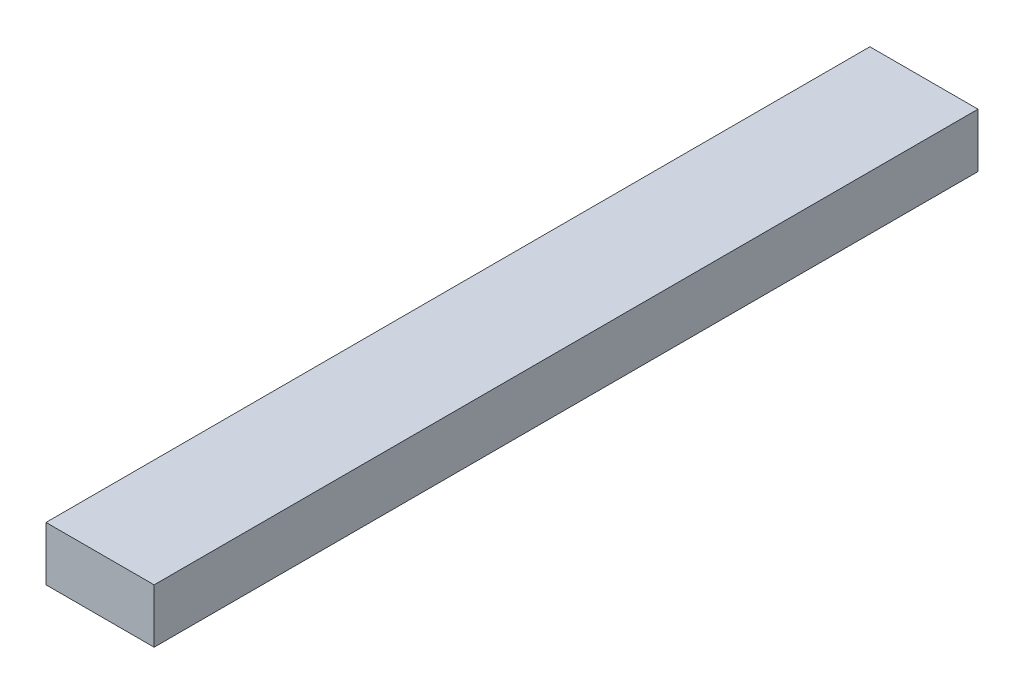
ISO-10303-21;
HEADER;
FILE_DESCRIPTION(('STEP AP214'),'2;1');
FILE_NAME('part.step','',(''),(''),'','','');
FILE_SCHEMA(('AUTOMOTIVE_DESIGN { 1 0 10303 214 1 1 1 1 }'));
ENDSEC;
DATA;
#1=APPLICATION_CONTEXT('core data for automotive mechanical design processes');
#2=APPLICATION_PROTOCOL_DEFINITION('international standard','automotive_design',2000,#1);
#3=PRODUCT_CONTEXT('',#1,'mechanical');
#4=PRODUCT('Part','Part','',(#3));
#5=PRODUCT_RELATED_PRODUCT_CATEGORY('part','',(#4));
#6=PRODUCT_DEFINITION_FORMATION('','',#4);
#7=PRODUCT_DEFINITION_CONTEXT('part definition',#1,'design');
#8=PRODUCT_DEFINITION('design','',#6,#7);
#9=PRODUCT_DEFINITION_SHAPE('','',#8);
#10=(LENGTH_UNIT() NAMED_UNIT(*) SI_UNIT(.MILLI.,.METRE.));
#11=(NAMED_UNIT(*) PLANE_ANGLE_UNIT() SI_UNIT($,.RADIAN.));
#12=(NAMED_UNIT(*) SI_UNIT($,.STERADIAN.) SOLID_ANGLE_UNIT());
#13=UNCERTAINTY_MEASURE_WITH_UNIT(LENGTH_MEASURE(1.E-05),#10,'distance_accuracy_value','');
#14=(GEOMETRIC_REPRESENTATION_CONTEXT(3) GLOBAL_UNCERTAINTY_ASSIGNED_CONTEXT((#13)) GLOBAL_UNIT_ASSIGNED_CONTEXT((#10,
#11,#12)) REPRESENTATION_CONTEXT('',''));
#15=CARTESIAN_POINT('',(0.,0.,0.));
#16=DIRECTION('',(0.,0.,1.));
#17=DIRECTION('',(1.,0.,0.));
#18=AXIS2_PLACEMENT_3D('',#15,#16,#17);
#19=CARTESIAN_POINT('',(30.,-15.,228.6));
#20=DIRECTION('',(-1.,0.,0.));
#21=DIRECTION('',(0.,0.,1.));
#22=AXIS2_PLACEMENT_3D('',#19,#20,#21);
#23=PLANE('',#22);
#24=DIRECTION('',(0.,1.,0.));
#25=VECTOR('',#24,1.);
#26=CARTESIAN_POINT('',(30.,-15.,-228.6));
#27=LINE('',#26,#25);
#28=CARTESIAN_POINT('',(30.,-15.,-228.6));
#29=VERTEX_POINT('',#28);
#30=CARTESIAN_POINT('',(30.,15.,-228.6));
#31=VERTEX_POINT('',#30);
#32=EDGE_CURVE('E107',#29,#31,#27,.T.);
#33=ORIENTED_EDGE('',*,*,#32,.T.);
#34=DIRECTION('',(0.,0.,-1.));
#35=VECTOR('',#34,1.);
#36=CARTESIAN_POINT('',(30.,15.,228.6));
#37=LINE('',#36,#35);
#38=CARTESIAN_POINT('',(30.,15.,228.6));
#39=VERTEX_POINT('',#38);
#40=EDGE_CURVE('E11',#39,#31,#37,.T.);
#41=ORIENTED_EDGE('',*,*,#40,.F.);
#42=DIRECTION('',(0.,1.,0.));
#43=VECTOR('',#42,1.);
#44=CARTESIAN_POINT('',(30.,-15.,228.6));
#45=LINE('',#44,#43);
#46=CARTESIAN_POINT('',(30.,-15.,228.6));
#47=VERTEX_POINT('',#46);
#48=EDGE_CURVE('E91',#47,#39,#45,.T.);
#49=ORIENTED_EDGE('',*,*,#48,.F.);
#50=DIRECTION('',(0.,0.,-1.));
#51=VECTOR('',#50,1.);
#52=CARTESIAN_POINT('',(30.,-15.,228.6));
#53=LINE('',#52,#51);
#54=EDGE_CURVE('E103',#47,#29,#53,.T.);
#55=ORIENTED_EDGE('',*,*,#54,.T.);
#56=EDGE_LOOP('',(#33,#41,#49,#55));
#57=FACE_BOUND('',#56,.T.);
#58=ADVANCED_FACE('F39',(#57),#23,.F.);
#59=CARTESIAN_POINT('',(-30.,15.,228.6));
#60=DIRECTION('',(0.,-1.,0.));
#61=DIRECTION('',(0.,0.,-1.));
#62=AXIS2_PLACEMENT_3D('',#59,#60,#61);
#63=PLANE('',#62);
#64=DIRECTION('',(-1.,0.,0.));
#65=VECTOR('',#64,1.);
#66=CARTESIAN_POINT('',(-30.,15.,-228.6));
#67=LINE('',#66,#65);
#68=CARTESIAN_POINT('',(-30.,15.,-228.6));
#69=VERTEX_POINT('',#68);
#70=EDGE_CURVE('E96',#31,#69,#67,.T.);
#71=ORIENTED_EDGE('',*,*,#70,.T.);
#72=DIRECTION('',(0.,0.,-1.));
#73=VECTOR('',#72,1.);
#74=CARTESIAN_POINT('',(-30.,15.,228.6));
#75=LINE('',#74,#73);
#76=CARTESIAN_POINT('',(-30.,15.,228.6));
#77=VERTEX_POINT('',#76);
#78=EDGE_CURVE('E48',#77,#69,#75,.T.);
#79=ORIENTED_EDGE('',*,*,#78,.F.);
#80=DIRECTION('',(-1.,0.,0.));
#81=VECTOR('',#80,1.);
#82=CARTESIAN_POINT('',(-30.,15.,228.6));
#83=LINE('',#82,#81);
#84=EDGE_CURVE('E86',#39,#77,#83,.T.);
#85=ORIENTED_EDGE('',*,*,#84,.F.);
#86=ORIENTED_EDGE('',*,*,#40,.T.);
#87=EDGE_LOOP('',(#71,#79,#85,#86));
#88=FACE_BOUND('',#87,.T.);
#89=ADVANCED_FACE('F95',(#88),#63,.F.);
#90=CARTESIAN_POINT('',(-30.,-15.,228.6));
#91=DIRECTION('',(1.,0.,0.));
#92=DIRECTION('',(0.,0.,-1.));
#93=AXIS2_PLACEMENT_3D('',#90,#91,#92);
#94=PLANE('',#93);
#95=DIRECTION('',(0.,-1.,0.));
#96=VECTOR('',#95,1.);
#97=CARTESIAN_POINT('',(-30.,-15.,-228.6));
#98=LINE('',#97,#96);
#99=CARTESIAN_POINT('',(-30.,-15.,-228.6));
#100=VERTEX_POINT('',#99);
#101=EDGE_CURVE('E73',#69,#100,#98,.T.);
#102=ORIENTED_EDGE('',*,*,#101,.T.);
#103=DIRECTION('',(0.,0.,-1.));
#104=VECTOR('',#103,1.);
#105=CARTESIAN_POINT('',(-30.,-15.,228.6));
#106=LINE('',#105,#104);
#107=CARTESIAN_POINT('',(-30.,-15.,228.6));
#108=VERTEX_POINT('',#107);
#109=EDGE_CURVE('E98',#108,#100,#106,.T.);
#110=ORIENTED_EDGE('',*,*,#109,.F.);
#111=DIRECTION('',(0.,-1.,0.));
#112=VECTOR('',#111,1.);
#113=CARTESIAN_POINT('',(-30.,-15.,228.6));
#114=LINE('',#113,#112);
#115=EDGE_CURVE('E89',#77,#108,#114,.T.);
#116=ORIENTED_EDGE('',*,*,#115,.F.);
#117=ORIENTED_EDGE('',*,*,#78,.T.);
#118=EDGE_LOOP('',(#102,#110,#116,#117));
#119=FACE_BOUND('',#118,.T.);
#120=ADVANCED_FACE('F99',(#119),#94,.F.);
#121=CARTESIAN_POINT('',(-30.,-15.,228.6));
#122=DIRECTION('',(0.,1.,0.));
#123=DIRECTION('',(0.,0.,1.));
#124=AXIS2_PLACEMENT_3D('',#121,#122,#123);
#125=PLANE('',#124);
#126=DIRECTION('',(1.,0.,0.));
#127=VECTOR('',#126,1.);
#128=CARTESIAN_POINT('',(-30.,-15.,-228.6));
#129=LINE('',#128,#127);
#130=EDGE_CURVE('E79',#100,#29,#129,.T.);
#131=ORIENTED_EDGE('',*,*,#130,.T.);
#132=ORIENTED_EDGE('',*,*,#54,.F.);
#133=DIRECTION('',(1.,0.,0.));
#134=VECTOR('',#133,1.);
#135=CARTESIAN_POINT('',(-30.,-15.,228.6));
#136=LINE('',#135,#134);
#137=EDGE_CURVE('E56',#108,#47,#136,.T.);
#138=ORIENTED_EDGE('',*,*,#137,.F.);
#139=ORIENTED_EDGE('',*,*,#109,.T.);
#140=EDGE_LOOP('',(#131,#132,#138,#139));
#141=FACE_BOUND('',#140,.T.);
#142=ADVANCED_FACE('F120',(#141),#125,.F.);
#143=CARTESIAN_POINT('',(0.,0.,228.6));
#144=DIRECTION('',(0.,0.,-1.));
#145=DIRECTION('',(-1.,0.,0.));
#146=AXIS2_PLACEMENT_3D('',#143,#144,#145);
#147=PLANE('',#146);
#148=ORIENTED_EDGE('',*,*,#48,.T.);
#149=ORIENTED_EDGE('',*,*,#84,.T.);
#150=ORIENTED_EDGE('',*,*,#115,.T.);
#151=ORIENTED_EDGE('',*,*,#137,.T.);
#152=EDGE_LOOP('',(#148,#149,#150,#151));
#153=FACE_BOUND('',#152,.T.);
#154=ADVANCED_FACE('F87',(#153),#147,.F.);
#155=CARTESIAN_POINT('',(0.,0.,-228.6));
#156=DIRECTION('',(0.,0.,-1.));
#157=DIRECTION('',(-1.,0.,0.));
#158=AXIS2_PLACEMENT_3D('',#155,#156,#157);
#159=PLANE('',#158);
#160=ORIENTED_EDGE('',*,*,#32,.F.);
#161=ORIENTED_EDGE('',*,*,#130,.F.);
#162=ORIENTED_EDGE('',*,*,#101,.F.);
#163=ORIENTED_EDGE('',*,*,#70,.F.);
#164=EDGE_LOOP('',(#160,#161,#162,#163));
#165=FACE_BOUND('',#164,.T.);
#166=ADVANCED_FACE('F123',(#165),#159,.T.);
#167=CLOSED_SHELL('',(#58,#89,#120,#142,#154,#166));
#168=MANIFOLD_SOLID_BREP('B2',#167);
#169=ADVANCED_BREP_SHAPE_REPRESENTATION('',(#18,#168),#14);
#170=SHAPE_DEFINITION_REPRESENTATION(#9,#169);
ENDSEC;
END-ISO-10303-21;
